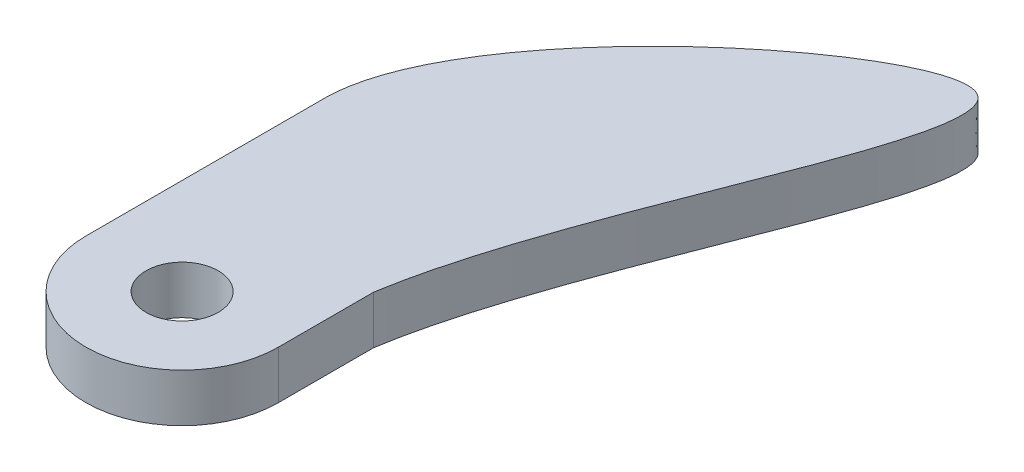
ISO-10303-21;
HEADER;
FILE_DESCRIPTION(('STEP AP214'),'2;1');
FILE_NAME('part.step','',(''),(''),'','','');
FILE_SCHEMA(('AUTOMOTIVE_DESIGN { 1 0 10303 214 1 1 1 1 }'));
ENDSEC;
DATA;
#1=APPLICATION_CONTEXT('core data for automotive mechanical design processes');
#2=APPLICATION_PROTOCOL_DEFINITION('international standard','automotive_design',2000,#1);
#3=PRODUCT_CONTEXT('',#1,'mechanical');
#4=PRODUCT('Part','Part','',(#3));
#5=PRODUCT_RELATED_PRODUCT_CATEGORY('part','',(#4));
#6=PRODUCT_DEFINITION_FORMATION('','',#4);
#7=PRODUCT_DEFINITION_CONTEXT('part definition',#1,'design');
#8=PRODUCT_DEFINITION('design','',#6,#7);
#9=PRODUCT_DEFINITION_SHAPE('','',#8);
#10=(LENGTH_UNIT() NAMED_UNIT(*) SI_UNIT(.MILLI.,.METRE.));
#11=(NAMED_UNIT(*) PLANE_ANGLE_UNIT() SI_UNIT($,.RADIAN.));
#12=(NAMED_UNIT(*) SI_UNIT($,.STERADIAN.) SOLID_ANGLE_UNIT());
#13=UNCERTAINTY_MEASURE_WITH_UNIT(LENGTH_MEASURE(1.E-05),#10,'distance_accuracy_value','');
#14=(GEOMETRIC_REPRESENTATION_CONTEXT(3) GLOBAL_UNCERTAINTY_ASSIGNED_CONTEXT((#13)) GLOBAL_UNIT_ASSIGNED_CONTEXT((#10,
#11,#12)) REPRESENTATION_CONTEXT('',''));
#15=CARTESIAN_POINT('',(0.,0.,0.));
#16=DIRECTION('',(0.,0.,1.));
#17=DIRECTION('',(1.,0.,0.));
#18=AXIS2_PLACEMENT_3D('',#15,#16,#17);
#19=CARTESIAN_POINT('',(0.,2.,0.));
#20=DIRECTION('',(0.,1.,0.));
#21=DIRECTION('',(0.,0.,1.));
#22=AXIS2_PLACEMENT_3D('',#19,#20,#21);
#23=PLANE('',#22);
#24=CARTESIAN_POINT('',(0.,2.,0.));
#25=DIRECTION('',(0.,1.,0.));
#26=DIRECTION('',(0.,0.,1.));
#27=AXIS2_PLACEMENT_3D('',#24,#25,#26);
#28=CIRCLE('',#27,4.);
#29=CARTESIAN_POINT('',(-4.,2.,0.));
#30=VERTEX_POINT('',#29);
#31=CARTESIAN_POINT('',(4.,2.,0.));
#32=VERTEX_POINT('',#31);
#33=EDGE_CURVE('E89',#30,#32,#28,.T.);
#34=ORIENTED_EDGE('',*,*,#33,.T.);
#35=DIRECTION('',(0.,0.,-1.));
#36=VECTOR('',#35,1.);
#37=CARTESIAN_POINT('',(4.,2.,-3.9575847350873));
#38=LINE('',#37,#36);
#39=CARTESIAN_POINT('',(4.,2.,-3.9575847350873));
#40=VERTEX_POINT('',#39);
#41=EDGE_CURVE('E84',#32,#40,#38,.T.);
#42=ORIENTED_EDGE('',*,*,#41,.T.);
#43=CARTESIAN_POINT('',(4.,2.,-3.9575847350873));
#44=CARTESIAN_POINT('',(5.22032882085243,2.,-11.6178644485138));
#45=CARTESIAN_POINT('',(18.1050993258037,2.,-33.4824982293405));
#46=CARTESIAN_POINT('',(-3.87918284291706,2.,-15.9815475279516));
#47=CARTESIAN_POINT('',(-4.,2.,-10.));
#48=B_SPLINE_CURVE_WITH_KNOTS('',3,(#43,#44,#45,#46,#47),.UNSPECIFIED.,.F.,.F.,(4,1,4),
(0.0900914278591475,0.554982663912815,1.),.UNSPECIFIED.);
#49=CARTESIAN_POINT('',(-4.,2.,-10.));
#50=VERTEX_POINT('',#49);
#51=EDGE_CURVE('E87',#40,#50,#48,.T.);
#52=ORIENTED_EDGE('',*,*,#51,.T.);
#53=DIRECTION('',(0.,0.,1.));
#54=VECTOR('',#53,1.);
#55=CARTESIAN_POINT('',(-4.,2.,-10.));
#56=LINE('',#55,#54);
#57=EDGE_CURVE('E54',#50,#30,#56,.T.);
#58=ORIENTED_EDGE('',*,*,#57,.T.);
#59=EDGE_LOOP('',(#34,#42,#52,#58));
#60=FACE_BOUND('',#59,.T.);
#61=CARTESIAN_POINT('',(0.,2.,0.));
#62=DIRECTION('',(0.,1.,0.));
#63=DIRECTION('',(0.,0.,1.));
#64=AXIS2_PLACEMENT_3D('',#61,#62,#63);
#65=CIRCLE('',#64,1.5);
#66=CARTESIAN_POINT('',(0.,2.,1.5));
#67=VERTEX_POINT('',#66);
#68=EDGE_CURVE('E134',#67,#67,#65,.T.);
#69=ORIENTED_EDGE('',*,*,#68,.F.);
#70=EDGE_LOOP('',(#69));
#71=FACE_BOUND('',#70,.T.);
#72=ADVANCED_FACE('F37',(#60,#71),#23,.T.);
#73=CARTESIAN_POINT('',(0.,0.,0.));
#74=DIRECTION('',(0.,1.,0.));
#75=DIRECTION('',(0.,0.,1.));
#76=AXIS2_PLACEMENT_3D('',#73,#74,#75);
#77=PLANE('',#76);
#78=CARTESIAN_POINT('',(0.,0.,0.));
#79=DIRECTION('',(0.,1.,0.));
#80=DIRECTION('',(0.,0.,1.));
#81=AXIS2_PLACEMENT_3D('',#78,#79,#80);
#82=CIRCLE('',#81,4.);
#83=CARTESIAN_POINT('',(-4.,0.,0.));
#84=VERTEX_POINT('',#83);
#85=CARTESIAN_POINT('',(4.,0.,0.));
#86=VERTEX_POINT('',#85);
#87=EDGE_CURVE('E140',#84,#86,#82,.T.);
#88=ORIENTED_EDGE('',*,*,#87,.F.);
#89=DIRECTION('',(0.,0.,1.));
#90=VECTOR('',#89,1.);
#91=CARTESIAN_POINT('',(-4.,0.,-10.));
#92=LINE('',#91,#90);
#93=CARTESIAN_POINT('',(-4.,0.,-10.));
#94=VERTEX_POINT('',#93);
#95=EDGE_CURVE('E77',#94,#84,#92,.T.);
#96=ORIENTED_EDGE('',*,*,#95,.F.);
#97=CARTESIAN_POINT('',(4.,0.,-3.9575847350873));
#98=CARTESIAN_POINT('',(5.22032882085243,0.,-11.6178644485138));
#99=CARTESIAN_POINT('',(18.1050993258037,0.,-33.4824982293405));
#100=CARTESIAN_POINT('',(-3.87918284291706,0.,-15.9815475279516));
#101=CARTESIAN_POINT('',(-4.,0.,-10.));
#102=B_SPLINE_CURVE_WITH_KNOTS('',3,(#97,#98,#99,#100,#101),.UNSPECIFIED.,.F.,.F.,(4,1,4),
(0.0900914278591475,0.554982663912815,1.),.UNSPECIFIED.);
#103=CARTESIAN_POINT('',(4.,0.,-3.9575847350873));
#104=VERTEX_POINT('',#103);
#105=EDGE_CURVE('E71',#104,#94,#102,.T.);
#106=ORIENTED_EDGE('',*,*,#105,.F.);
#107=DIRECTION('',(0.,0.,-1.));
#108=VECTOR('',#107,1.);
#109=CARTESIAN_POINT('',(4.,0.,-3.9575847350873));
#110=LINE('',#109,#108);
#111=EDGE_CURVE('E93',#86,#104,#110,.T.);
#112=ORIENTED_EDGE('',*,*,#111,.F.);
#113=EDGE_LOOP('',(#88,#96,#106,#112));
#114=FACE_BOUND('',#113,.T.);
#115=CARTESIAN_POINT('',(0.,0.,0.));
#116=DIRECTION('',(0.,1.,0.));
#117=DIRECTION('',(0.,0.,1.));
#118=AXIS2_PLACEMENT_3D('',#115,#116,#117);
#119=CIRCLE('',#118,1.5);
#120=CARTESIAN_POINT('',(0.,0.,1.5));
#121=VERTEX_POINT('',#120);
#122=EDGE_CURVE('E137',#121,#121,#119,.T.);
#123=ORIENTED_EDGE('',*,*,#122,.T.);
#124=EDGE_LOOP('',(#123));
#125=FACE_BOUND('',#124,.T.);
#126=ADVANCED_FACE('F116',(#114,#125),#77,.F.);
#127=CARTESIAN_POINT('',(0.,2.,0.));
#128=DIRECTION('',(0.,-1.,0.));
#129=DIRECTION('',(0.,0.,-1.));
#130=AXIS2_PLACEMENT_3D('',#127,#128,#129);
#131=CYLINDRICAL_SURFACE('',#130,4.);
#132=ORIENTED_EDGE('',*,*,#87,.T.);
#133=DIRECTION('',(0.,-1.,0.));
#134=VECTOR('',#133,1.);
#135=CARTESIAN_POINT('',(4.,2.,0.));
#136=LINE('',#135,#134);
#137=EDGE_CURVE('E11',#32,#86,#136,.T.);
#138=ORIENTED_EDGE('',*,*,#137,.F.);
#139=ORIENTED_EDGE('',*,*,#33,.F.);
#140=DIRECTION('',(0.,-1.,0.));
#141=VECTOR('',#140,1.);
#142=CARTESIAN_POINT('',(-4.,2.,0.));
#143=LINE('',#142,#141);
#144=EDGE_CURVE('E97',#30,#84,#143,.T.);
#145=ORIENTED_EDGE('',*,*,#144,.T.);
#146=EDGE_LOOP('',(#132,#138,#139,#145));
#147=FACE_BOUND('',#146,.T.);
#148=ADVANCED_FACE('F39',(#147),#131,.T.);
#149=CARTESIAN_POINT('',(4.,2.,-3.9575847350873));
#150=DIRECTION('',(-1.,0.,0.));
#151=DIRECTION('',(0.,0.,1.));
#152=AXIS2_PLACEMENT_3D('',#149,#150,#151);
#153=PLANE('',#152);
#154=ORIENTED_EDGE('',*,*,#111,.T.);
#155=DIRECTION('',(0.,-1.,0.));
#156=VECTOR('',#155,1.);
#157=CARTESIAN_POINT('',(4.,2.,-3.9575847350873));
#158=LINE('',#157,#156);
#159=EDGE_CURVE('E46',#40,#104,#158,.T.);
#160=ORIENTED_EDGE('',*,*,#159,.F.);
#161=ORIENTED_EDGE('',*,*,#41,.F.);
#162=ORIENTED_EDGE('',*,*,#137,.T.);
#163=EDGE_LOOP('',(#154,#160,#161,#162));
#164=FACE_BOUND('',#163,.T.);
#165=ADVANCED_FACE('F92',(#164),#153,.F.);
#166=DIRECTION('',(0.,-1.,0.));
#167=VECTOR('',#166,1.);
#168=SURFACE_OF_LINEAR_EXTRUSION('',#48,#167);
#169=ORIENTED_EDGE('',*,*,#105,.T.);
#170=DIRECTION('',(0.,-1.,0.));
#171=VECTOR('',#170,1.);
#172=CARTESIAN_POINT('',(-4.,2.,-10.));
#173=LINE('',#172,#171);
#174=EDGE_CURVE('E94',#50,#94,#173,.T.);
#175=ORIENTED_EDGE('',*,*,#174,.F.);
#176=ORIENTED_EDGE('',*,*,#51,.F.);
#177=ORIENTED_EDGE('',*,*,#159,.T.);
#178=EDGE_LOOP('',(#169,#175,#176,#177));
#179=FACE_BOUND('',#178,.T.);
#180=ADVANCED_FACE('F95',(#179),#168,.F.);
#181=CARTESIAN_POINT('',(-4.,2.,-10.));
#182=DIRECTION('',(1.,0.,0.));
#183=DIRECTION('',(0.,0.,-1.));
#184=AXIS2_PLACEMENT_3D('',#181,#182,#183);
#185=PLANE('',#184);
#186=ORIENTED_EDGE('',*,*,#95,.T.);
#187=ORIENTED_EDGE('',*,*,#144,.F.);
#188=ORIENTED_EDGE('',*,*,#57,.F.);
#189=ORIENTED_EDGE('',*,*,#174,.T.);
#190=EDGE_LOOP('',(#186,#187,#188,#189));
#191=FACE_BOUND('',#190,.T.);
#192=ADVANCED_FACE('F110',(#191),#185,.F.);
#193=CARTESIAN_POINT('',(0.,2.,0.));
#194=DIRECTION('',(0.,-1.,0.));
#195=DIRECTION('',(0.,0.,-1.));
#196=AXIS2_PLACEMENT_3D('',#193,#194,#195);
#197=CYLINDRICAL_SURFACE('',#196,1.5);
#198=ORIENTED_EDGE('',*,*,#68,.T.);
#199=EDGE_LOOP('',(#198));
#200=FACE_BOUND('',#199,.T.);
#201=ORIENTED_EDGE('',*,*,#122,.F.);
#202=EDGE_LOOP('',(#201));
#203=FACE_BOUND('',#202,.T.);
#204=ADVANCED_FACE('F125',(#200,#203),#197,.F.);
#205=CLOSED_SHELL('',(#72,#126,#148,#165,#180,#192,#204));
#206=MANIFOLD_SOLID_BREP('B2',#205);
#207=ADVANCED_BREP_SHAPE_REPRESENTATION('',(#18,#206),#14);
#208=SHAPE_DEFINITION_REPRESENTATION(#9,#207);
ENDSEC;
END-ISO-10303-21;
